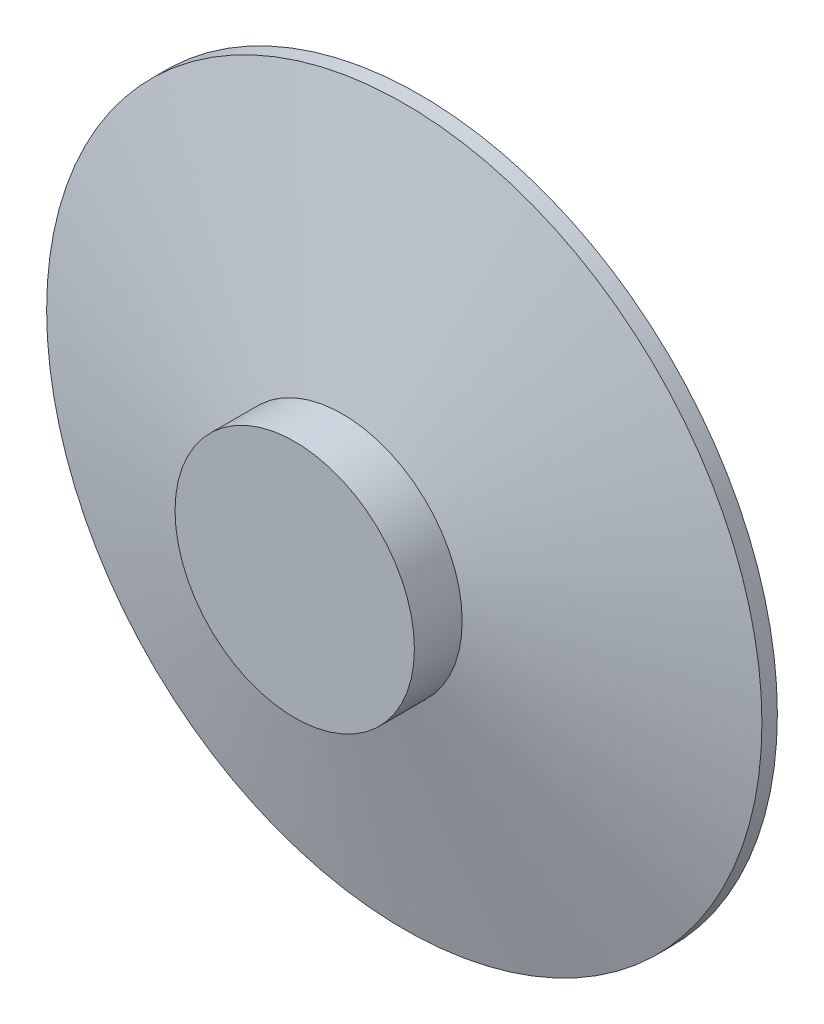
ISO-10303-21;
HEADER;
FILE_DESCRIPTION(('STEP AP214'),'2;1');
FILE_NAME('part.step','',(''),(''),'','','');
FILE_SCHEMA(('AUTOMOTIVE_DESIGN { 1 0 10303 214 1 1 1 1 }'));
ENDSEC;
DATA;
#1=APPLICATION_CONTEXT('core data for automotive mechanical design processes');
#2=APPLICATION_PROTOCOL_DEFINITION('international standard','automotive_design',2000,#1);
#3=PRODUCT_CONTEXT('',#1,'mechanical');
#4=PRODUCT('Part','Part','',(#3));
#5=PRODUCT_RELATED_PRODUCT_CATEGORY('part','',(#4));
#6=PRODUCT_DEFINITION_FORMATION('','',#4);
#7=PRODUCT_DEFINITION_CONTEXT('part definition',#1,'design');
#8=PRODUCT_DEFINITION('design','',#6,#7);
#9=PRODUCT_DEFINITION_SHAPE('','',#8);
#10=(LENGTH_UNIT() NAMED_UNIT(*) SI_UNIT(.MILLI.,.METRE.));
#11=(NAMED_UNIT(*) PLANE_ANGLE_UNIT() SI_UNIT($,.RADIAN.));
#12=(NAMED_UNIT(*) SI_UNIT($,.STERADIAN.) SOLID_ANGLE_UNIT());
#13=UNCERTAINTY_MEASURE_WITH_UNIT(LENGTH_MEASURE(1.E-05),#10,'distance_accuracy_value','');
#14=(GEOMETRIC_REPRESENTATION_CONTEXT(3) GLOBAL_UNCERTAINTY_ASSIGNED_CONTEXT((#13)) GLOBAL_UNIT_ASSIGNED_CONTEXT((#10,
#11,#12)) REPRESENTATION_CONTEXT('',''));
#15=CARTESIAN_POINT('',(0.,0.,0.));
#16=DIRECTION('',(0.,0.,1.));
#17=DIRECTION('',(1.,0.,0.));
#18=AXIS2_PLACEMENT_3D('',#15,#16,#17);
#19=CARTESIAN_POINT('',(0.,0.,0.));
#20=DIRECTION('',(0.,0.,-1.));
#21=DIRECTION('',(-1.,0.,0.));
#22=AXIS2_PLACEMENT_3D('',#19,#20,#21);
#23=PLANE('',#22);
#24=CARTESIAN_POINT('',(0.,0.,0.));
#25=DIRECTION('',(0.,0.,1.));
#26=DIRECTION('',(1.,0.,0.));
#27=AXIS2_PLACEMENT_3D('',#24,#25,#26);
#28=CIRCLE('',#27,5.82739581888792);
#29=CARTESIAN_POINT('',(5.82739581888792,0.,0.));
#30=VERTEX_POINT('',#29);
#31=EDGE_CURVE('E11',#30,#30,#28,.T.);
#32=ORIENTED_EDGE('',*,*,#31,.T.);
#33=EDGE_LOOP('',(#32));
#34=FACE_BOUND('',#33,.T.);
#35=ADVANCED_FACE('F33',(#34),#23,.F.);
#36=CARTESIAN_POINT('',(0.,0.,0.));
#37=DIRECTION('',(0.,0.,1.));
#38=DIRECTION('',(1.,0.,0.));
#39=AXIS2_PLACEMENT_3D('',#36,#37,#38);
#40=CYLINDRICAL_SURFACE('',#39,5.82739581888792);
#41=ORIENTED_EDGE('',*,*,#31,.F.);
#42=EDGE_LOOP('',(#41));
#43=FACE_BOUND('',#42,.T.);
#44=CARTESIAN_POINT('',(0.,0.,-2.32698744450102));
#45=DIRECTION('',(0.,0.,1.));
#46=DIRECTION('',(1.,0.,0.));
#47=AXIS2_PLACEMENT_3D('',#44,#45,#46);
#48=CIRCLE('',#47,5.82739581888792);
#49=CARTESIAN_POINT('',(5.82739581888792,0.,-2.32698744450102));
#50=VERTEX_POINT('',#49);
#51=EDGE_CURVE('E39',#50,#50,#48,.T.);
#52=ORIENTED_EDGE('',*,*,#51,.T.);
#53=EDGE_LOOP('',(#52));
#54=FACE_BOUND('',#53,.T.);
#55=ADVANCED_FACE('F55',(#43,#54),#40,.T.);
#56=CARTESIAN_POINT('',(0.,0.,-5.3346143260548));
#57=DIRECTION('',(0.,0.,-1.));
#58=DIRECTION('',(-1.,0.,0.));
#59=AXIS2_PLACEMENT_3D('',#56,#57,#58);
#60=CONICAL_SURFACE('',#59,17.4156052742863,1.3168573300002);
#61=ORIENTED_EDGE('',*,*,#51,.F.);
#62=EDGE_LOOP('',(#61));
#63=FACE_BOUND('',#62,.T.);
#64=CARTESIAN_POINT('',(0.,0.,-5.3346143260548));
#65=DIRECTION('',(0.,0.,1.));
#66=DIRECTION('',(1.,0.,0.));
#67=AXIS2_PLACEMENT_3D('',#64,#65,#66);
#68=CIRCLE('',#67,17.4156052742863);
#69=CARTESIAN_POINT('',(17.4156052742863,0.,-5.3346143260548));
#70=VERTEX_POINT('',#69);
#71=EDGE_CURVE('E67',#70,#70,#68,.T.);
#72=ORIENTED_EDGE('',*,*,#71,.T.);
#73=EDGE_LOOP('',(#72));
#74=FACE_BOUND('',#73,.T.);
#75=ADVANCED_FACE('F60',(#63,#74),#60,.T.);
#76=CARTESIAN_POINT('',(0.,0.,0.));
#77=DIRECTION('',(0.,0.,1.));
#78=DIRECTION('',(1.,0.,0.));
#79=AXIS2_PLACEMENT_3D('',#76,#77,#78);
#80=CYLINDRICAL_SURFACE('',#79,17.4156052742863);
#81=ORIENTED_EDGE('',*,*,#71,.F.);
#82=EDGE_LOOP('',(#81));
#83=FACE_BOUND('',#82,.T.);
#84=CARTESIAN_POINT('',(0.,0.,-6.08652104644325));
#85=DIRECTION('',(0.,0.,1.));
#86=DIRECTION('',(1.,0.,0.));
#87=AXIS2_PLACEMENT_3D('',#84,#85,#86);
#88=CIRCLE('',#87,17.4156052742863);
#89=CARTESIAN_POINT('',(17.4156052742863,0.,-6.08652104644325));
#90=VERTEX_POINT('',#89);
#91=EDGE_CURVE('E69',#90,#90,#88,.T.);
#92=ORIENTED_EDGE('',*,*,#91,.T.);
#93=EDGE_LOOP('',(#92));
#94=FACE_BOUND('',#93,.T.);
#95=ADVANCED_FACE('F50',(#83,#94),#80,.T.);
#96=CARTESIAN_POINT('',(0.,17.4156052742863,-6.08652104644325));
#97=DIRECTION('',(0.,0.,1.));
#98=DIRECTION('',(1.,0.,0.));
#99=AXIS2_PLACEMENT_3D('',#96,#97,#98);
#100=PLANE('',#99);
#101=ORIENTED_EDGE('',*,*,#91,.F.);
#102=EDGE_LOOP('',(#101));
#103=FACE_BOUND('',#102,.T.);
#104=CARTESIAN_POINT('',(0.,0.,-6.08652104644325));
#105=DIRECTION('',(0.,0.,1.));
#106=DIRECTION('',(1.,0.,0.));
#107=AXIS2_PLACEMENT_3D('',#104,#105,#106);
#108=CIRCLE('',#107,16.25);
#109=CARTESIAN_POINT('',(16.25,0.,-6.08652104644325));
#110=VERTEX_POINT('',#109);
#111=EDGE_CURVE('E74',#110,#110,#108,.T.);
#112=ORIENTED_EDGE('',*,*,#111,.T.);
#113=EDGE_LOOP('',(#112));
#114=FACE_BOUND('',#113,.T.);
#115=ADVANCED_FACE('F44',(#103,#114),#100,.F.);
#116=CARTESIAN_POINT('',(0.,0.,-4.49424799150301));
#117=DIRECTION('',(0.,0.,-1.));
#118=DIRECTION('',(-1.,0.,0.));
#119=AXIS2_PLACEMENT_3D('',#116,#117,#118);
#120=CONICAL_SURFACE('',#119,0.,1.47312209494632);
#121=ORIENTED_EDGE('',*,*,#111,.F.);
#122=EDGE_LOOP('',(#121));
#123=FACE_BOUND('',#122,.T.);
#124=CARTESIAN_POINT('',(0.,0.,-4.49424799150301));
#125=VERTEX_POINT('',#124);
#126=VERTEX_LOOP('',#125);
#127=FACE_BOUND('',#126,.T.);
#128=ADVANCED_FACE('F42',(#123,#127),#120,.F.);
#129=CLOSED_SHELL('',(#35,#55,#75,#95,#115,#128));
#130=MANIFOLD_SOLID_BREP('B2',#129);
#131=ADVANCED_BREP_SHAPE_REPRESENTATION('',(#18,#130),#14);
#132=SHAPE_DEFINITION_REPRESENTATION(#9,#131);
ENDSEC;
END-ISO-10303-21;
